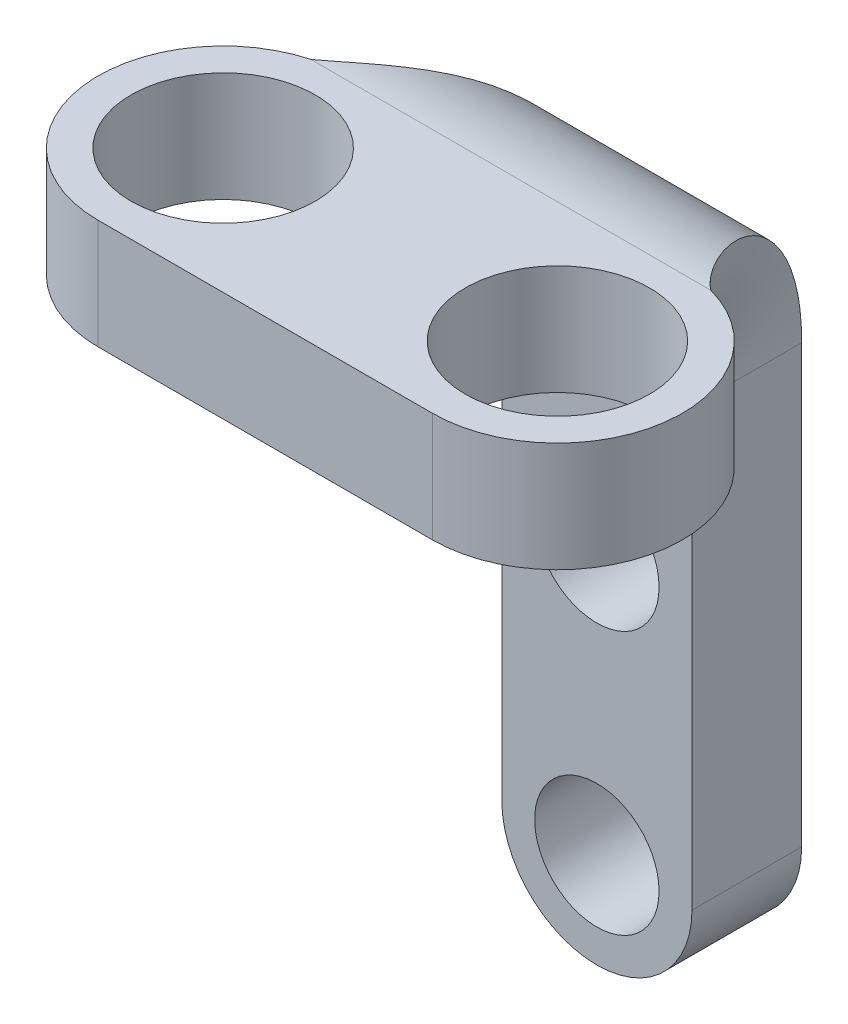
ISO-10303-21;
HEADER;
FILE_DESCRIPTION(('STEP AP214'),'2;1');
FILE_NAME('part.step','',(''),(''),'','','');
FILE_SCHEMA(('AUTOMOTIVE_DESIGN { 1 0 10303 214 1 1 1 1 }'));
ENDSEC;
DATA;
#1=APPLICATION_CONTEXT('core data for automotive mechanical design processes');
#2=APPLICATION_PROTOCOL_DEFINITION('international standard','automotive_design',2000,#1);
#3=PRODUCT_CONTEXT('',#1,'mechanical');
#4=PRODUCT('Part','Part','',(#3));
#5=PRODUCT_RELATED_PRODUCT_CATEGORY('part','',(#4));
#6=PRODUCT_DEFINITION_FORMATION('','',#4);
#7=PRODUCT_DEFINITION_CONTEXT('part definition',#1,'design');
#8=PRODUCT_DEFINITION('design','',#6,#7);
#9=PRODUCT_DEFINITION_SHAPE('','',#8);
#10=(LENGTH_UNIT() NAMED_UNIT(*) SI_UNIT(.MILLI.,.METRE.));
#11=(NAMED_UNIT(*) PLANE_ANGLE_UNIT() SI_UNIT($,.RADIAN.));
#12=(NAMED_UNIT(*) SI_UNIT($,.STERADIAN.) SOLID_ANGLE_UNIT());
#13=UNCERTAINTY_MEASURE_WITH_UNIT(LENGTH_MEASURE(1.E-05),#10,'distance_accuracy_value','');
#14=(GEOMETRIC_REPRESENTATION_CONTEXT(3) GLOBAL_UNCERTAINTY_ASSIGNED_CONTEXT((#13)) GLOBAL_UNIT_ASSIGNED_CONTEXT((#10,
#11,#12)) REPRESENTATION_CONTEXT('',''));
#15=CARTESIAN_POINT('',(0.,0.,0.));
#16=DIRECTION('',(0.,0.,1.));
#17=DIRECTION('',(1.,0.,0.));
#18=AXIS2_PLACEMENT_3D('',#15,#16,#17);
#19=CARTESIAN_POINT('',(6.7020407836892,15.1175002814664,13.5));
#20=DIRECTION('',(0.,-1.,0.));
#21=DIRECTION('',(0.,0.,-1.));
#22=AXIS2_PLACEMENT_3D('',#19,#20,#21);
#23=CYLINDRICAL_SURFACE('',#22,5.7);
#24=CARTESIAN_POINT('',(8.19870373839879,20.1175002814664,8.));
#25=CARTESIAN_POINT('',(8.19870373839879,15.1175002814664,8.));
#26=B_SPLINE_CURVE_WITH_KNOTS('',1,(#24,#25),.UNSPECIFIED.,.F.,.F.,(2,2),(0.,1.),.UNSPECIFIED.);
#27=CARTESIAN_POINT('',(8.19870373839879,20.1175002814664,8.));
#28=VERTEX_POINT('',#27);
#29=CARTESIAN_POINT('',(8.19870373839879,15.1175002814664,8.));
#30=VERTEX_POINT('',#29);
#31=EDGE_CURVE('E11',#28,#30,#26,.T.);
#32=ORIENTED_EDGE('',*,*,#31,.F.);
#33=CARTESIAN_POINT('',(6.7020407836892,20.1175002814664,13.5));
#34=DIRECTION('',(0.,1.,0.));
#35=DIRECTION('',(0.,0.,1.));
#36=AXIS2_PLACEMENT_3D('',#33,#34,#35);
#37=CIRCLE('',#36,5.7);
#38=CARTESIAN_POINT('',(6.7020407836892,20.1175002814664,19.2));
#39=VERTEX_POINT('',#38);
#40=EDGE_CURVE('E99',#39,#28,#37,.T.);
#41=ORIENTED_EDGE('',*,*,#40,.F.);
#42=DIRECTION('',(0.,-1.,0.));
#43=VECTOR('',#42,1.);
#44=CARTESIAN_POINT('',(6.7020407836892,15.1175002814664,19.2));
#45=LINE('',#44,#43);
#46=CARTESIAN_POINT('',(6.7020407836892,15.1175002814664,19.2));
#47=VERTEX_POINT('',#46);
#48=EDGE_CURVE('E57',#39,#47,#45,.T.);
#49=ORIENTED_EDGE('',*,*,#48,.T.);
#50=CARTESIAN_POINT('',(6.7020407836892,15.1175002814664,13.5));
#51=DIRECTION('',(0.,1.,0.));
#52=DIRECTION('',(0.,0.,1.));
#53=AXIS2_PLACEMENT_3D('',#50,#51,#52);
#54=CIRCLE('',#53,5.7);
#55=EDGE_CURVE('E102',#47,#30,#54,.T.);
#56=ORIENTED_EDGE('',*,*,#55,.T.);
#57=EDGE_LOOP('',(#32,#41,#49,#56));
#58=FACE_BOUND('',#57,.T.);
#59=ADVANCED_FACE('F45',(#58),#23,.T.);
#60=CARTESIAN_POINT('',(6.7020407836892,15.1175002814664,19.2));
#61=DIRECTION('',(0.,0.,-1.));
#62=DIRECTION('',(1.,0.,0.));
#63=AXIS2_PLACEMENT_3D('',#60,#61,#62);
#64=PLANE('',#63);
#65=ORIENTED_EDGE('',*,*,#48,.F.);
#66=DIRECTION('',(1.,0.,0.));
#67=VECTOR('',#66,1.);
#68=CARTESIAN_POINT('',(4.33500039736429,20.1175002814664,19.2));
#69=LINE('',#68,#67);
#70=CARTESIAN_POINT('',(-8.53500039736429,20.1175002814664,19.2));
#71=VERTEX_POINT('',#70);
#72=EDGE_CURVE('E131',#71,#39,#69,.T.);
#73=ORIENTED_EDGE('',*,*,#72,.F.);
#74=DIRECTION('',(0.,-1.,0.));
#75=VECTOR('',#74,1.);
#76=CARTESIAN_POINT('',(-8.53500039736429,15.1175002814664,19.2));
#77=LINE('',#76,#75);
#78=CARTESIAN_POINT('',(-8.53500039736429,15.1175002814664,19.2));
#79=VERTEX_POINT('',#78);
#80=EDGE_CURVE('E179',#71,#79,#77,.T.);
#81=ORIENTED_EDGE('',*,*,#80,.T.);
#82=DIRECTION('',(1.,0.,0.));
#83=VECTOR('',#82,1.);
#84=CARTESIAN_POINT('',(6.7020407836892,15.1175002814664,19.2));
#85=LINE('',#84,#83);
#86=EDGE_CURVE('E266',#79,#47,#85,.T.);
#87=ORIENTED_EDGE('',*,*,#86,.T.);
#88=EDGE_LOOP('',(#65,#73,#81,#87));
#89=FACE_BOUND('',#88,.T.);
#90=ADVANCED_FACE('F412',(#89),#64,.F.);
#91=CARTESIAN_POINT('',(-8.53500039736429,15.1175002814664,13.5));
#92=DIRECTION('',(0.,-1.,0.));
#93=DIRECTION('',(0.,0.,-1.));
#94=AXIS2_PLACEMENT_3D('',#91,#92,#93);
#95=CYLINDRICAL_SURFACE('',#94,5.7);
#96=ORIENTED_EDGE('',*,*,#80,.F.);
#97=CARTESIAN_POINT('',(-8.53500039736429,20.1175002814664,13.5));
#98=DIRECTION('',(0.,1.,0.));
#99=DIRECTION('',(0.,0.,1.));
#100=AXIS2_PLACEMENT_3D('',#97,#98,#99);
#101=CIRCLE('',#100,5.7);
#102=CARTESIAN_POINT('',(-10.0316633520739,20.1175002814664,8.));
#103=VERTEX_POINT('',#102);
#104=EDGE_CURVE('E258',#103,#71,#101,.T.);
#105=ORIENTED_EDGE('',*,*,#104,.F.);
#106=CARTESIAN_POINT('',(-10.0316633520739,15.1175002814664,8.));
#107=CARTESIAN_POINT('',(-10.0316633520739,20.1175002814664,8.));
#108=B_SPLINE_CURVE_WITH_KNOTS('',1,(#106,#107),.UNSPECIFIED.,.F.,.F.,(2,2),(0.,1.),.UNSPECIFIED.);
#109=CARTESIAN_POINT('',(-10.0316633520739,15.1175002814664,8.));
#110=VERTEX_POINT('',#109);
#111=EDGE_CURVE('E182',#103,#110,#108,.F.);
#112=ORIENTED_EDGE('',*,*,#111,.T.);
#113=CARTESIAN_POINT('',(-8.53500039736429,15.1175002814664,13.5));
#114=DIRECTION('',(0.,1.,0.));
#115=DIRECTION('',(0.,0.,1.));
#116=AXIS2_PLACEMENT_3D('',#113,#114,#115);
#117=CIRCLE('',#116,5.7);
#118=EDGE_CURVE('E257',#110,#79,#117,.T.);
#119=ORIENTED_EDGE('',*,*,#118,.T.);
#120=EDGE_LOOP('',(#96,#105,#112,#119));
#121=FACE_BOUND('',#120,.T.);
#122=ADVANCED_FACE('F201',(#121),#95,.T.);
#123=CARTESIAN_POINT('',(-4.33500039736429,12.1175002814664,0.));
#124=CARTESIAN_POINT('',(-4.33500039736429,13.7033826471891,0.));
#125=CARTESIAN_POINT('',(-4.54825582272542,15.1470793069077,0.474747132833706));
#126=CARTESIAN_POINT('',(-5.08162528327855,16.8672490977594,1.5276100914214));
#127=CARTESIAN_POINT('',(-5.29499615721484,17.3684457516512,1.93406196108079));
#128=CARTESIAN_POINT('',(-5.77516721000283,18.223125508579,2.79525474120899));
#129=CARTESIAN_POINT('',(-6.04196738885455,18.5768663565233,3.24982170294797));
#130=CARTESIAN_POINT('',(-6.89591267890027,19.4411980951591,4.60679117718446));
#131=CARTESIAN_POINT('',(-7.53660254358486,19.7535824024262,5.49565836960644));
#132=CARTESIAN_POINT('',(-8.81890586155524,20.0891959135856,6.98336540063976));
#133=CARTESIAN_POINT('',(-9.4613422370783,20.1175002814664,7.58614376479876));
#134=CARTESIAN_POINT('',(-10.0316633520739,20.1175002814664,8.));
#135=CARTESIAN_POINT('',(-4.33500039736429,12.1175002814664,5.));
#136=CARTESIAN_POINT('',(-4.33500039736429,12.7122061686124,5.));
#137=CARTESIAN_POINT('',(-4.54825582272542,13.2535924160069,5.17803017481264));
#138=CARTESIAN_POINT('',(-5.08162528327855,13.8986560875763,5.57285378428302));
#139=CARTESIAN_POINT('',(-5.29499615721484,14.0866048327857,5.7252732354053));
#140=CARTESIAN_POINT('',(-5.77516721000283,14.4071097416336,6.04822052795337));
#141=CARTESIAN_POINT('',(-6.04196738885455,14.5397625596127,6.21868313860549));
#142=CARTESIAN_POINT('',(-6.89591267890027,14.8638869616012,6.72754669144417));
#143=CARTESIAN_POINT('',(-7.53660254358486,14.9810310768263,7.06087188860241));
#144=CARTESIAN_POINT('',(-8.81890586155524,15.1068861435111,7.61876202523991));
#145=CARTESIAN_POINT('',(-9.46068379560002,15.1175002814664,7.84462473635074));
#146=CARTESIAN_POINT('',(-10.0316633520739,15.1175002814664,8.));
#147=B_SPLINE_SURFACE_WITH_KNOTS('',1,3,((#123,#124,#125,#126,#127,#128,#129,#130,#131,#132,
#133,#134),(#135,#136,#137,#138,#139,#140,#141,#142,#143,#144,#145,#146)),.UNSPECIFIED.,.F.,.F.,
.F.,(2,2),(4,2,2,2,2,4),(0.,1.),(0.,0.25,0.375,0.5,0.75,1.),.UNSPECIFIED.);
#148=CARTESIAN_POINT('',(-10.0316633520739,20.1175002814664,8.));
#149=CARTESIAN_POINT('',(-9.4613422370783,20.1175002814664,7.58614376479876));
#150=CARTESIAN_POINT('',(-8.81890586155524,20.0891959135856,6.98336540063976));
#151=CARTESIAN_POINT('',(-7.53660254358486,19.7535824024262,5.49565836960644));
#152=CARTESIAN_POINT('',(-6.89591267890027,19.4411980951591,4.60679117718446));
#153=CARTESIAN_POINT('',(-6.04196738885455,18.5768663565233,3.24982170294797));
#154=CARTESIAN_POINT('',(-5.77516721000283,18.223125508579,2.79525474120899));
#155=CARTESIAN_POINT('',(-5.29499615721484,17.3684457516512,1.93406196108079));
#156=CARTESIAN_POINT('',(-5.08162528327855,16.8672490977594,1.5276100914214));
#157=CARTESIAN_POINT('',(-4.54825582272542,15.1470793069077,0.474747132833706));
#158=CARTESIAN_POINT('',(-4.33500039736429,13.7033826471891,0.));
#159=CARTESIAN_POINT('',(-4.33500039736429,12.1175002814664,0.));
#160=B_SPLINE_CURVE_WITH_KNOTS('',3,(#148,#149,#150,#151,#152,#153,#154,#155,#156,#157,#158,
#159),.UNSPECIFIED.,.F.,.F.,(4,2,2,2,2,4),(0.,0.25,0.5,0.625,0.75,1.),.UNSPECIFIED.);
#161=CARTESIAN_POINT('',(-4.33500039736429,12.1175002814664,0.));
#162=VERTEX_POINT('',#161);
#163=EDGE_CURVE('E120',#103,#162,#160,.T.);
#164=CARTESIAN_POINT('',(-4.33500039736429,12.1175002814664,0.));
#165=CARTESIAN_POINT('',(-4.33500039736429,12.1175002814664,5.));
#166=B_SPLINE_CURVE_WITH_KNOTS('',1,(#164,#165),.UNSPECIFIED.,.F.,.F.,(2,2),(0.,1.),.UNSPECIFIED.);
#167=CARTESIAN_POINT('',(-4.33500039736429,12.1175002814664,5.));
#168=VERTEX_POINT('',#167);
#169=EDGE_CURVE('E236',#162,#168,#166,.T.);
#170=CARTESIAN_POINT('',(-4.33500039736429,12.1175002814664,5.));
#171=CARTESIAN_POINT('',(-4.33500039736429,12.7122061686124,5.));
#172=CARTESIAN_POINT('',(-4.54825582272542,13.2535924160069,5.17803017481264));
#173=CARTESIAN_POINT('',(-5.08162528327855,13.8986560875763,5.57285378428302));
#174=CARTESIAN_POINT('',(-5.29499615721484,14.0866048327857,5.7252732354053));
#175=CARTESIAN_POINT('',(-5.77516721000283,14.4071097416336,6.04822052795337));
#176=CARTESIAN_POINT('',(-6.04196738885455,14.5397625596127,6.21868313860549));
#177=CARTESIAN_POINT('',(-6.89591267890027,14.8638869616012,6.72754669144417));
#178=CARTESIAN_POINT('',(-7.53660254358486,14.9810310768263,7.06087188860241));
#179=CARTESIAN_POINT('',(-8.81890586155524,15.1068861435111,7.61876202523991));
#180=CARTESIAN_POINT('',(-9.46068379560002,15.1175002814664,7.84462473635074));
#181=CARTESIAN_POINT('',(-10.0316633520739,15.1175002814664,8.));
#182=B_SPLINE_CURVE_WITH_KNOTS('',3,(#170,#171,#172,#173,#174,#175,#176,#177,#178,#179,#180,
#181),.UNSPECIFIED.,.F.,.F.,(4,2,2,2,2,4),(0.,0.25,0.375,0.5,0.75,1.),.UNSPECIFIED.);
#183=EDGE_CURVE('E270',#110,#168,#182,.F.);
#184=ORIENTED_EDGE('',*,*,#111,.F.);
#185=ORIENTED_EDGE('',*,*,#163,.T.);
#186=ORIENTED_EDGE('',*,*,#169,.T.);
#187=ORIENTED_EDGE('',*,*,#183,.F.);
#188=EDGE_LOOP('',(#184,#185,#186,#187));
#189=FACE_BOUND('',#188,.T.);
#190=ADVANCED_FACE('F188',(#189),#147,.T.);
#191=CARTESIAN_POINT('',(-4.33500039736429,12.1175002814664,5.));
#192=DIRECTION('',(-1.,0.,0.));
#193=DIRECTION('',(0.,-1.,0.));
#194=AXIS2_PLACEMENT_3D('',#191,#192,#193);
#195=PLANE('',#194);
#196=ORIENTED_EDGE('',*,*,#169,.F.);
#197=DIRECTION('',(0.,1.,0.));
#198=VECTOR('',#197,1.);
#199=CARTESIAN_POINT('',(-4.33500039736429,-7.78249988410209,0.));
#200=LINE('',#199,#198);
#201=CARTESIAN_POINT('',(-4.33500039736429,-7.78249988410209,0.));
#202=VERTEX_POINT('',#201);
#203=EDGE_CURVE('E364',#162,#202,#200,.F.);
#204=ORIENTED_EDGE('',*,*,#203,.T.);
#205=DIRECTION('',(0.,0.,1.));
#206=VECTOR('',#205,1.);
#207=CARTESIAN_POINT('',(-4.33500039736429,-7.78249988410209,5.));
#208=LINE('',#207,#206);
#209=CARTESIAN_POINT('',(-4.33500039736429,-7.78249988410209,5.));
#210=VERTEX_POINT('',#209);
#211=EDGE_CURVE('E399',#202,#210,#208,.T.);
#212=ORIENTED_EDGE('',*,*,#211,.T.);
#213=DIRECTION('',(0.,-1.,0.));
#214=VECTOR('',#213,1.);
#215=CARTESIAN_POINT('',(-4.33500039736429,12.1175002814664,5.));
#216=LINE('',#215,#214);
#217=EDGE_CURVE('E267',#168,#210,#216,.T.);
#218=ORIENTED_EDGE('',*,*,#217,.F.);
#219=EDGE_LOOP('',(#196,#204,#212,#218));
#220=FACE_BOUND('',#219,.T.);
#221=ADVANCED_FACE('F200',(#220),#195,.T.);
#222=CARTESIAN_POINT('',(0.,-7.78249988410209,5.));
#223=DIRECTION('',(0.,0.,1.));
#224=DIRECTION('',(1.,0.,0.));
#225=AXIS2_PLACEMENT_3D('',#222,#223,#224);
#226=CYLINDRICAL_SURFACE('',#225,4.33500039736429);
#227=ORIENTED_EDGE('',*,*,#211,.F.);
#228=CARTESIAN_POINT('',(0.,-7.78249988410209,0.));
#229=DIRECTION('',(0.,0.,1.));
#230=DIRECTION('',(1.,0.,0.));
#231=AXIS2_PLACEMENT_3D('',#228,#229,#230);
#232=CIRCLE('',#231,4.33500039736429);
#233=CARTESIAN_POINT('',(4.33500039736429,-7.78249988410209,0.));
#234=VERTEX_POINT('',#233);
#235=EDGE_CURVE('E323',#202,#234,#232,.T.);
#236=ORIENTED_EDGE('',*,*,#235,.T.);
#237=DIRECTION('',(0.,0.,1.));
#238=VECTOR('',#237,1.);
#239=CARTESIAN_POINT('',(4.33500039736429,-7.78249988410209,5.));
#240=LINE('',#239,#238);
#241=CARTESIAN_POINT('',(4.33500039736429,-7.78249988410209,5.));
#242=VERTEX_POINT('',#241);
#243=EDGE_CURVE('E145',#234,#242,#240,.T.);
#244=ORIENTED_EDGE('',*,*,#243,.T.);
#245=CARTESIAN_POINT('',(0.,-7.78249988410209,5.));
#246=DIRECTION('',(0.,0.,1.));
#247=DIRECTION('',(1.,0.,0.));
#248=AXIS2_PLACEMENT_3D('',#245,#246,#247);
#249=CIRCLE('',#248,4.33500039736429);
#250=EDGE_CURVE('E334',#210,#242,#249,.T.);
#251=ORIENTED_EDGE('',*,*,#250,.F.);
#252=EDGE_LOOP('',(#227,#236,#244,#251));
#253=FACE_BOUND('',#252,.T.);
#254=ADVANCED_FACE('F398',(#253),#226,.T.);
#255=CARTESIAN_POINT('',(4.33500039736429,-7.78249988410209,5.));
#256=DIRECTION('',(1.,0.,0.));
#257=DIRECTION('',(0.,1.,0.));
#258=AXIS2_PLACEMENT_3D('',#255,#256,#257);
#259=PLANE('',#258);
#260=ORIENTED_EDGE('',*,*,#243,.F.);
#261=DIRECTION('',(0.,1.,0.));
#262=VECTOR('',#261,1.);
#263=CARTESIAN_POINT('',(4.33500039736429,-7.78249988410209,0.));
#264=LINE('',#263,#262);
#265=CARTESIAN_POINT('',(4.33500039736429,12.1175002814664,0.));
#266=VERTEX_POINT('',#265);
#267=EDGE_CURVE('E315',#234,#266,#264,.T.);
#268=ORIENTED_EDGE('',*,*,#267,.T.);
#269=CARTESIAN_POINT('',(4.33500039736429,12.1175002814664,5.));
#270=CARTESIAN_POINT('',(4.33500039736429,12.1175002814664,0.));
#271=B_SPLINE_CURVE_WITH_KNOTS('',1,(#269,#270),.UNSPECIFIED.,.F.,.F.,(2,2),(0.,1.),.UNSPECIFIED.);
#272=CARTESIAN_POINT('',(4.33500039736429,12.1175002814664,5.));
#273=VERTEX_POINT('',#272);
#274=EDGE_CURVE('E65',#266,#273,#271,.F.);
#275=ORIENTED_EDGE('',*,*,#274,.T.);
#276=DIRECTION('',(0.,1.,0.));
#277=VECTOR('',#276,1.);
#278=CARTESIAN_POINT('',(4.33500039736429,-7.78249988410209,5.));
#279=LINE('',#278,#277);
#280=EDGE_CURVE('E328',#242,#273,#279,.T.);
#281=ORIENTED_EDGE('',*,*,#280,.F.);
#282=EDGE_LOOP('',(#260,#268,#275,#281));
#283=FACE_BOUND('',#282,.T.);
#284=ADVANCED_FACE('F406',(#283),#259,.T.);
#285=CARTESIAN_POINT('',(6.7020407836892,15.1175002814664,13.5));
#286=DIRECTION('',(0.,-1.,0.));
#287=DIRECTION('',(0.,0.,-1.));
#288=AXIS2_PLACEMENT_3D('',#285,#286,#287);
#289=CYLINDRICAL_SURFACE('',#288,4.2);
#290=CARTESIAN_POINT('',(6.7020407836892,15.1175002814664,13.5));
#291=DIRECTION('',(0.,1.,0.));
#292=DIRECTION('',(0.,0.,1.));
#293=AXIS2_PLACEMENT_3D('',#290,#291,#292);
#294=CIRCLE('',#293,4.2);
#295=CARTESIAN_POINT('',(6.7020407836892,15.1175002814664,17.7));
#296=VERTEX_POINT('',#295);
#297=EDGE_CURVE('E274',#296,#296,#294,.T.);
#298=ORIENTED_EDGE('',*,*,#297,.F.);
#299=EDGE_LOOP('',(#298));
#300=FACE_BOUND('',#299,.T.);
#301=CARTESIAN_POINT('',(6.7020407836892,20.1175002814664,13.5));
#302=DIRECTION('',(0.,1.,0.));
#303=DIRECTION('',(0.,0.,1.));
#304=AXIS2_PLACEMENT_3D('',#301,#302,#303);
#305=CIRCLE('',#304,4.2);
#306=CARTESIAN_POINT('',(6.7020407836892,20.1175002814664,17.7));
#307=VERTEX_POINT('',#306);
#308=EDGE_CURVE('E370',#307,#307,#305,.T.);
#309=ORIENTED_EDGE('',*,*,#308,.T.);
#310=EDGE_LOOP('',(#309));
#311=FACE_BOUND('',#310,.T.);
#312=ADVANCED_FACE('F482',(#300,#311),#289,.F.);
#313=CARTESIAN_POINT('',(-8.53500039736429,15.1175002814664,13.5));
#314=DIRECTION('',(0.,-1.,0.));
#315=DIRECTION('',(0.,0.,-1.));
#316=AXIS2_PLACEMENT_3D('',#313,#314,#315);
#317=CYLINDRICAL_SURFACE('',#316,4.2);
#318=CARTESIAN_POINT('',(-8.53500039736429,15.1175002814664,13.5));
#319=DIRECTION('',(0.,1.,0.));
#320=DIRECTION('',(0.,0.,1.));
#321=AXIS2_PLACEMENT_3D('',#318,#319,#320);
#322=CIRCLE('',#321,4.2);
#323=CARTESIAN_POINT('',(-8.53500039736429,15.1175002814664,17.7));
#324=VERTEX_POINT('',#323);
#325=EDGE_CURVE('E353',#324,#324,#322,.T.);
#326=ORIENTED_EDGE('',*,*,#325,.F.);
#327=EDGE_LOOP('',(#326));
#328=FACE_BOUND('',#327,.T.);
#329=CARTESIAN_POINT('',(-8.53500039736429,20.1175002814664,13.5));
#330=DIRECTION('',(0.,1.,0.));
#331=DIRECTION('',(0.,0.,1.));
#332=AXIS2_PLACEMENT_3D('',#329,#330,#331);
#333=CIRCLE('',#332,4.2);
#334=CARTESIAN_POINT('',(-8.53500039736429,20.1175002814664,17.7));
#335=VERTEX_POINT('',#334);
#336=EDGE_CURVE('E132',#335,#335,#333,.T.);
#337=ORIENTED_EDGE('',*,*,#336,.T.);
#338=EDGE_LOOP('',(#337));
#339=FACE_BOUND('',#338,.T.);
#340=ADVANCED_FACE('F47',(#328,#339),#317,.F.);
#341=CARTESIAN_POINT('',(8.19870373839879,20.1175002814664,8.));
#342=CARTESIAN_POINT('',(7.73850772332937,20.1175002814664,7.66605656840757));
#343=CARTESIAN_POINT('',(7.26510153644234,20.1024339216392,7.02509239067049));
#344=CARTESIAN_POINT('',(6.59199561477027,19.8187938564485,5.79376343219699));
#345=CARTESIAN_POINT('',(6.37348974723305,19.6796210036649,5.3394457009954));
#346=CARTESIAN_POINT('',(5.95675996732754,19.2769480539895,4.39354376325328));
#347=CARTESIAN_POINT('',(5.75853605495924,19.0130881007331,3.90218391639246));
#348=CARTESIAN_POINT('',(5.39092659452023,18.3446895330785,2.94397962297445));
#349=CARTESIAN_POINT('',(5.22154104644951,17.9400018541628,2.47755926656727));
#350=CARTESIAN_POINT('',(4.9201647237343,17.0013281749922,1.63233941507966));
#351=CARTESIAN_POINT('',(4.78817394908981,16.467487303695,1.25401479711521));
#352=CARTESIAN_POINT('',(4.5701435823557,15.309915081169,0.635273854532169));
#353=CARTESIAN_POINT('',(4.48410399026608,14.686594973886,0.395192615036762));
#354=CARTESIAN_POINT('',(4.36653239777038,13.4089174278333,0.0775266074868139));
#355=CARTESIAN_POINT('',(4.33500039736429,12.7550321549002,0.));
#356=CARTESIAN_POINT('',(4.33500039736429,12.1175002814664,0.));
#357=CARTESIAN_POINT('',(8.19870373839879,15.1175002814664,8.));
#358=CARTESIAN_POINT('',(7.73753331893105,15.1175002814664,7.8745060577045));
#359=CARTESIAN_POINT('',(7.26510153644234,15.1118503965312,7.63440964650143));
#360=CARTESIAN_POINT('',(6.59199561477027,15.0054853720847,7.17266128707387));
#361=CARTESIAN_POINT('',(6.37348974723305,14.9532955522908,7.00229213787328));
#362=CARTESIAN_POINT('',(5.95675996732754,14.8022931961626,6.64757891121998));
#363=CARTESIAN_POINT('',(5.75853605495924,14.7033457136914,6.46331896864717));
#364=CARTESIAN_POINT('',(5.39092659452023,14.4526962508209,6.10399235861542));
#365=CARTESIAN_POINT('',(5.22154104644951,14.3009383712275,5.92908472496273));
#366=CARTESIAN_POINT('',(4.9201647237343,13.9489357415386,5.61212728065487));
#367=CARTESIAN_POINT('',(4.78817394908981,13.7487454148021,5.4702555489182));
#368=CARTESIAN_POINT('',(4.5701435823557,13.3146558313549,5.23822769544956));
#369=CARTESIAN_POINT('',(4.48410399026608,13.0809107911237,5.14819723063879));
#370=CARTESIAN_POINT('',(4.36653239777038,12.601781711354,5.02907247780756));
#371=CARTESIAN_POINT('',(4.33500039736429,12.3565747340041,5.));
#372=CARTESIAN_POINT('',(4.33500039736429,12.1175002814664,5.));
#373=B_SPLINE_SURFACE_WITH_KNOTS('',1,3,((#341,#342,#343,#344,#345,#346,#347,#348,#349,#350,
#351,#352,#353,#354,#355,#356),(#357,#358,#359,#360,#361,#362,#363,#364,#365,#366,#367,#368,
#369,#370,#371,#372)),.UNSPECIFIED.,.F.,.F.,.F.,(2,2),(4,2,2,2,2,2,2,4),(0.,1.),(0.,0.25,0.375,
0.5,0.625,0.75,0.875,1.),.UNSPECIFIED.);
#374=CARTESIAN_POINT('',(4.33500039736429,12.1175002814664,0.));
#375=CARTESIAN_POINT('',(4.33500039736429,12.7550321549002,0.));
#376=CARTESIAN_POINT('',(4.36653239777038,13.4089174278333,0.0775266074868139));
#377=CARTESIAN_POINT('',(4.48410399026608,14.686594973886,0.395192615036762));
#378=CARTESIAN_POINT('',(4.5701435823557,15.309915081169,0.635273854532169));
#379=CARTESIAN_POINT('',(4.78817394908981,16.467487303695,1.25401479711521));
#380=CARTESIAN_POINT('',(4.9201647237343,17.0013281749922,1.63233941507966));
#381=CARTESIAN_POINT('',(5.22154104644951,17.9400018541628,2.47755926656727));
#382=CARTESIAN_POINT('',(5.39092659452023,18.3446895330785,2.94397962297445));
#383=CARTESIAN_POINT('',(5.75853605495924,19.0130881007331,3.90218391639246));
#384=CARTESIAN_POINT('',(5.95675996732754,19.2769480539895,4.39354376325328));
#385=CARTESIAN_POINT('',(6.37348974723305,19.6796210036649,5.3394457009954));
#386=CARTESIAN_POINT('',(6.59199561477027,19.8187938564485,5.79376343219699));
#387=CARTESIAN_POINT('',(7.26510153644234,20.1024339216392,7.02509239067049));
#388=CARTESIAN_POINT('',(7.73850772332937,20.1175002814664,7.66605656840757));
#389=CARTESIAN_POINT('',(8.19870373839879,20.1175002814664,8.));
#390=B_SPLINE_CURVE_WITH_KNOTS('',3,(#374,#375,#376,#377,#378,#379,#380,#381,#382,#383,#384,
#385,#386,#387,#388,#389),.UNSPECIFIED.,.F.,.F.,(4,2,2,2,2,2,2,4),(0.,0.125,0.25,0.375,0.5,
0.625,0.75,1.),.UNSPECIFIED.);
#391=EDGE_CURVE('E117',#266,#28,#390,.T.);
#392=CARTESIAN_POINT('',(8.19870373839879,15.1175002814664,8.));
#393=CARTESIAN_POINT('',(7.73753331893105,15.1175002814664,7.8745060577045));
#394=CARTESIAN_POINT('',(7.26510153644234,15.1118503965312,7.63440964650143));
#395=CARTESIAN_POINT('',(6.59199561477027,15.0054853720847,7.17266128707387));
#396=CARTESIAN_POINT('',(6.37348974723305,14.9532955522908,7.00229213787328));
#397=CARTESIAN_POINT('',(5.95675996732754,14.8022931961626,6.64757891121998));
#398=CARTESIAN_POINT('',(5.75853605495924,14.7033457136914,6.46331896864717));
#399=CARTESIAN_POINT('',(5.39092659452023,14.4526962508209,6.10399235861542));
#400=CARTESIAN_POINT('',(5.22154104644951,14.3009383712275,5.92908472496273));
#401=CARTESIAN_POINT('',(4.9201647237343,13.9489357415386,5.61212728065487));
#402=CARTESIAN_POINT('',(4.78817394908981,13.7487454148021,5.4702555489182));
#403=CARTESIAN_POINT('',(4.5701435823557,13.3146558313549,5.23822769544956));
#404=CARTESIAN_POINT('',(4.48410399026608,13.0809107911237,5.14819723063879));
#405=CARTESIAN_POINT('',(4.36653239777038,12.601781711354,5.02907247780756));
#406=CARTESIAN_POINT('',(4.33500039736429,12.3565747340041,5.));
#407=CARTESIAN_POINT('',(4.33500039736429,12.1175002814664,5.));
#408=B_SPLINE_CURVE_WITH_KNOTS('',3,(#392,#393,#394,#395,#396,#397,#398,#399,#400,#401,#402,
#403,#404,#405,#406,#407),.UNSPECIFIED.,.F.,.F.,(4,2,2,2,2,2,2,4),(0.,0.25,0.375,0.5,0.625,0.75,
0.875,1.),.UNSPECIFIED.);
#409=EDGE_CURVE('E275',#273,#30,#408,.F.);
#410=ORIENTED_EDGE('',*,*,#391,.T.);
#411=ORIENTED_EDGE('',*,*,#31,.T.);
#412=ORIENTED_EDGE('',*,*,#409,.F.);
#413=ORIENTED_EDGE('',*,*,#274,.F.);
#414=EDGE_LOOP('',(#410,#411,#412,#413));
#415=FACE_BOUND('',#414,.T.);
#416=ADVANCED_FACE('F135',(#415),#373,.T.);
#417=CARTESIAN_POINT('',(0.,-7.78249988410209,5.));
#418=DIRECTION('',(0.,0.,1.));
#419=DIRECTION('',(1.,0.,0.));
#420=AXIS2_PLACEMENT_3D('',#417,#418,#419);
#421=CYLINDRICAL_SURFACE('',#420,2.83500039736429);
#422=CARTESIAN_POINT('',(0.,-7.78249988410209,5.));
#423=DIRECTION('',(0.,0.,1.));
#424=DIRECTION('',(1.,0.,0.));
#425=AXIS2_PLACEMENT_3D('',#422,#423,#424);
#426=CIRCLE('',#425,2.83500039736429);
#427=CARTESIAN_POINT('',(2.83500039736429,-7.78249988410209,5.));
#428=VERTEX_POINT('',#427);
#429=EDGE_CURVE('E285',#428,#428,#426,.T.);
#430=ORIENTED_EDGE('',*,*,#429,.T.);
#431=EDGE_LOOP('',(#430));
#432=FACE_BOUND('',#431,.T.);
#433=CARTESIAN_POINT('',(0.,-7.78249988410209,0.));
#434=DIRECTION('',(0.,0.,1.));
#435=DIRECTION('',(1.,0.,0.));
#436=AXIS2_PLACEMENT_3D('',#433,#434,#435);
#437=CIRCLE('',#436,2.83500039736429);
#438=CARTESIAN_POINT('',(2.83500039736429,-7.78249988410209,0.));
#439=VERTEX_POINT('',#438);
#440=EDGE_CURVE('E322',#439,#439,#437,.T.);
#441=ORIENTED_EDGE('',*,*,#440,.F.);
#442=EDGE_LOOP('',(#441));
#443=FACE_BOUND('',#442,.T.);
#444=ADVANCED_FACE('F158',(#432,#443),#421,.F.);
#445=CARTESIAN_POINT('',(3.97364280368961E-07,4.21750011589792,5.));
#446=DIRECTION('',(0.,0.,1.));
#447=DIRECTION('',(1.,0.,0.));
#448=AXIS2_PLACEMENT_3D('',#445,#446,#447);
#449=CYLINDRICAL_SURFACE('',#448,2.83500079472856);
#450=CARTESIAN_POINT('',(3.97364280368961E-07,4.21750011589792,5.));
#451=DIRECTION('',(0.,0.,1.));
#452=DIRECTION('',(1.,0.,0.));
#453=AXIS2_PLACEMENT_3D('',#450,#451,#452);
#454=CIRCLE('',#453,2.83500079472856);
#455=CARTESIAN_POINT('',(2.83500119209284,4.21750011589792,5.));
#456=VERTEX_POINT('',#455);
#457=EDGE_CURVE('E280',#456,#456,#454,.T.);
#458=ORIENTED_EDGE('',*,*,#457,.T.);
#459=EDGE_LOOP('',(#458));
#460=FACE_BOUND('',#459,.T.);
#461=CARTESIAN_POINT('',(3.97364280368961E-07,4.21750011589792,0.));
#462=DIRECTION('',(0.,0.,1.));
#463=DIRECTION('',(1.,0.,0.));
#464=AXIS2_PLACEMENT_3D('',#461,#462,#463);
#465=CIRCLE('',#464,2.83500079472856);
#466=CARTESIAN_POINT('',(2.83500119209284,4.21750011589792,0.));
#467=VERTEX_POINT('',#466);
#468=EDGE_CURVE('E126',#467,#467,#465,.T.);
#469=ORIENTED_EDGE('',*,*,#468,.F.);
#470=EDGE_LOOP('',(#469));
#471=FACE_BOUND('',#470,.T.);
#472=ADVANCED_FACE('F514',(#460,#471),#449,.F.);
#473=CARTESIAN_POINT('',(0.,-7.78249988410209,5.));
#474=DIRECTION('',(0.,0.,1.));
#475=DIRECTION('',(1.,0.,0.));
#476=AXIS2_PLACEMENT_3D('',#473,#474,#475);
#477=PLANE('',#476);
#478=ORIENTED_EDGE('',*,*,#280,.T.);
#479=DIRECTION('',(1.,0.,0.));
#480=VECTOR('',#479,1.);
#481=CARTESIAN_POINT('',(-4.33500039736429,12.1175002814664,5.));
#482=LINE('',#481,#480);
#483=EDGE_CURVE('E279',#273,#168,#482,.F.);
#484=ORIENTED_EDGE('',*,*,#483,.T.);
#485=ORIENTED_EDGE('',*,*,#217,.T.);
#486=ORIENTED_EDGE('',*,*,#250,.T.);
#487=EDGE_LOOP('',(#478,#484,#485,#486));
#488=FACE_BOUND('',#487,.T.);
#489=ORIENTED_EDGE('',*,*,#429,.F.);
#490=EDGE_LOOP('',(#489));
#491=FACE_BOUND('',#490,.T.);
#492=ORIENTED_EDGE('',*,*,#457,.F.);
#493=EDGE_LOOP('',(#492));
#494=FACE_BOUND('',#493,.T.);
#495=ADVANCED_FACE('F329',(#488,#491,#494),#477,.T.);
#496=CARTESIAN_POINT('',(4.33500039736429,15.1175002814664,18.));
#497=DIRECTION('',(0.,-1.,0.));
#498=DIRECTION('',(0.,0.,-1.));
#499=AXIS2_PLACEMENT_3D('',#496,#497,#498);
#500=PLANE('',#499);
#501=ORIENTED_EDGE('',*,*,#297,.T.);
#502=EDGE_LOOP('',(#501));
#503=FACE_BOUND('',#502,.T.);
#504=ORIENTED_EDGE('',*,*,#325,.T.);
#505=EDGE_LOOP('',(#504));
#506=FACE_BOUND('',#505,.T.);
#507=ORIENTED_EDGE('',*,*,#118,.F.);
#508=DIRECTION('',(1.,0.,0.));
#509=VECTOR('',#508,1.);
#510=CARTESIAN_POINT('',(4.33500039736429,15.1175002814664,8.));
#511=LINE('',#510,#509);
#512=EDGE_CURVE('E264',#110,#30,#511,.T.);
#513=ORIENTED_EDGE('',*,*,#512,.T.);
#514=ORIENTED_EDGE('',*,*,#55,.F.);
#515=ORIENTED_EDGE('',*,*,#86,.F.);
#516=EDGE_LOOP('',(#507,#513,#514,#515));
#517=FACE_BOUND('',#516,.T.);
#518=ADVANCED_FACE('F262',(#503,#506,#517),#500,.T.);
#519=CARTESIAN_POINT('',(4.33500039736429,12.1175002814664,8.));
#520=DIRECTION('',(-1.,0.,0.));
#521=DIRECTION('',(0.,0.,1.));
#522=AXIS2_PLACEMENT_3D('',#519,#520,#521);
#523=CYLINDRICAL_SURFACE('',#522,3.);
#524=ORIENTED_EDGE('',*,*,#183,.T.);
#525=ORIENTED_EDGE('',*,*,#483,.F.);
#526=ORIENTED_EDGE('',*,*,#409,.T.);
#527=ORIENTED_EDGE('',*,*,#512,.F.);
#528=EDGE_LOOP('',(#524,#525,#526,#527));
#529=FACE_BOUND('',#528,.T.);
#530=ADVANCED_FACE('F277',(#529),#523,.F.);
#531=CARTESIAN_POINT('',(0.,-7.78249988410209,0.));
#532=DIRECTION('',(0.,0.,1.));
#533=DIRECTION('',(1.,0.,0.));
#534=AXIS2_PLACEMENT_3D('',#531,#532,#533);
#535=PLANE('',#534);
#536=ORIENTED_EDGE('',*,*,#267,.F.);
#537=ORIENTED_EDGE('',*,*,#235,.F.);
#538=ORIENTED_EDGE('',*,*,#203,.F.);
#539=DIRECTION('',(1.,0.,0.));
#540=VECTOR('',#539,1.);
#541=CARTESIAN_POINT('',(0.,12.1175002814664,0.));
#542=LINE('',#541,#540);
#543=EDGE_CURVE('E125',#266,#162,#542,.F.);
#544=ORIENTED_EDGE('',*,*,#543,.F.);
#545=EDGE_LOOP('',(#536,#537,#538,#544));
#546=FACE_BOUND('',#545,.T.);
#547=ORIENTED_EDGE('',*,*,#440,.T.);
#548=EDGE_LOOP('',(#547));
#549=FACE_BOUND('',#548,.T.);
#550=ORIENTED_EDGE('',*,*,#468,.T.);
#551=EDGE_LOOP('',(#550));
#552=FACE_BOUND('',#551,.T.);
#553=ADVANCED_FACE('F307',(#546,#549,#552),#535,.F.);
#554=CARTESIAN_POINT('',(4.33500039736429,20.1175002814664,18.));
#555=DIRECTION('',(0.,-1.,0.));
#556=DIRECTION('',(0.,0.,-1.));
#557=AXIS2_PLACEMENT_3D('',#554,#555,#556);
#558=PLANE('',#557);
#559=ORIENTED_EDGE('',*,*,#308,.F.);
#560=EDGE_LOOP('',(#559));
#561=FACE_BOUND('',#560,.T.);
#562=ORIENTED_EDGE('',*,*,#336,.F.);
#563=EDGE_LOOP('',(#562));
#564=FACE_BOUND('',#563,.T.);
#565=ORIENTED_EDGE('',*,*,#104,.T.);
#566=ORIENTED_EDGE('',*,*,#72,.T.);
#567=ORIENTED_EDGE('',*,*,#40,.T.);
#568=DIRECTION('',(1.,0.,0.));
#569=VECTOR('',#568,1.);
#570=CARTESIAN_POINT('',(4.33500039736429,20.1175002814664,8.));
#571=LINE('',#570,#569);
#572=EDGE_CURVE('E114',#103,#28,#571,.T.);
#573=ORIENTED_EDGE('',*,*,#572,.F.);
#574=EDGE_LOOP('',(#565,#566,#567,#573));
#575=FACE_BOUND('',#574,.T.);
#576=ADVANCED_FACE('F129',(#561,#564,#575),#558,.F.);
#577=CARTESIAN_POINT('',(4.33500039736429,12.1175002814664,8.));
#578=DIRECTION('',(-1.,0.,0.));
#579=DIRECTION('',(0.,0.,1.));
#580=AXIS2_PLACEMENT_3D('',#577,#578,#579);
#581=CYLINDRICAL_SURFACE('',#580,8.);
#582=ORIENTED_EDGE('',*,*,#163,.F.);
#583=ORIENTED_EDGE('',*,*,#572,.T.);
#584=ORIENTED_EDGE('',*,*,#391,.F.);
#585=ORIENTED_EDGE('',*,*,#543,.T.);
#586=EDGE_LOOP('',(#582,#583,#584,#585));
#587=FACE_BOUND('',#586,.T.);
#588=ADVANCED_FACE('F115',(#587),#581,.T.);
#589=CLOSED_SHELL('',(#59,#90,#122,#190,#221,#254,#284,#312,#340,#416,#444,#472,#495,#518,#530,
#553,#576,#588));
#590=MANIFOLD_SOLID_BREP('B2',#589);
#591=ADVANCED_BREP_SHAPE_REPRESENTATION('',(#18,#590),#14);
#592=SHAPE_DEFINITION_REPRESENTATION(#9,#591);
ENDSEC;
END-ISO-10303-21;
